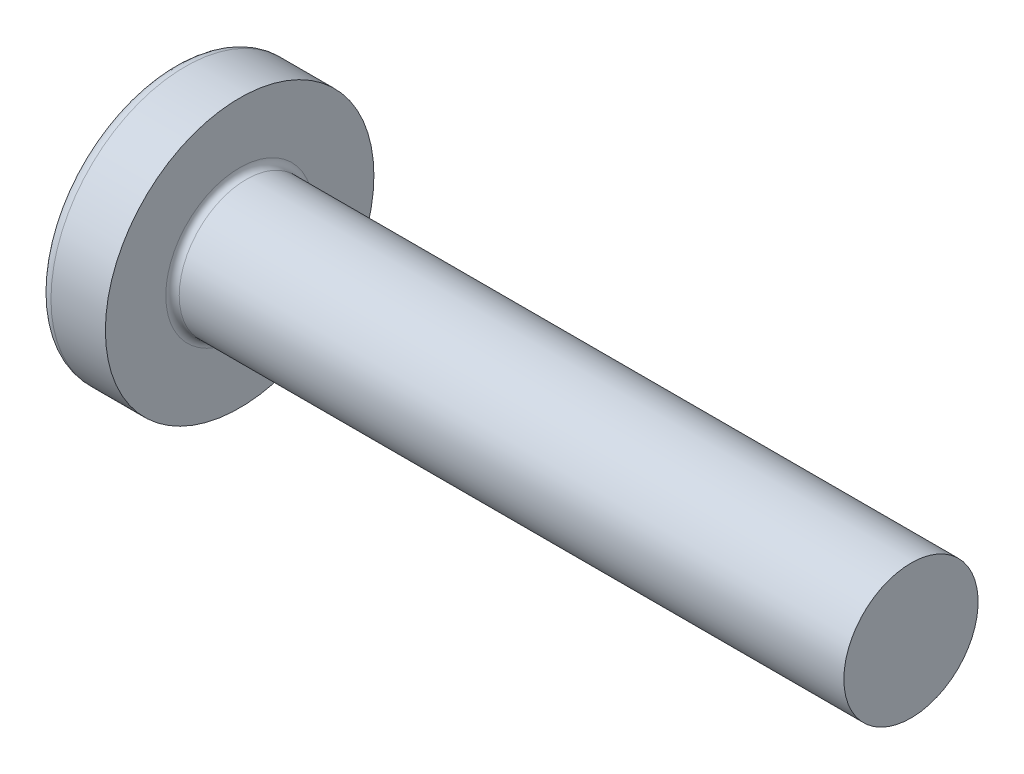
ISO-10303-21;
HEADER;
FILE_DESCRIPTION(('STEP AP214'),'2;1');
FILE_NAME('part.step','',(''),(''),'','','');
FILE_SCHEMA(('AUTOMOTIVE_DESIGN { 1 0 10303 214 1 1 1 1 }'));
ENDSEC;
DATA;
#1=APPLICATION_CONTEXT('core data for automotive mechanical design processes');
#2=APPLICATION_PROTOCOL_DEFINITION('international standard','automotive_design',2000,#1);
#3=PRODUCT_CONTEXT('',#1,'mechanical');
#4=PRODUCT('Part','Part','',(#3));
#5=PRODUCT_RELATED_PRODUCT_CATEGORY('part','',(#4));
#6=PRODUCT_DEFINITION_FORMATION('','',#4);
#7=PRODUCT_DEFINITION_CONTEXT('part definition',#1,'design');
#8=PRODUCT_DEFINITION('design','',#6,#7);
#9=PRODUCT_DEFINITION_SHAPE('','',#8);
#10=(LENGTH_UNIT() NAMED_UNIT(*) SI_UNIT(.MILLI.,.METRE.));
#11=(NAMED_UNIT(*) PLANE_ANGLE_UNIT() SI_UNIT($,.RADIAN.));
#12=(NAMED_UNIT(*) SI_UNIT($,.STERADIAN.) SOLID_ANGLE_UNIT());
#13=UNCERTAINTY_MEASURE_WITH_UNIT(LENGTH_MEASURE(1.E-05),#10,'distance_accuracy_value','');
#14=(GEOMETRIC_REPRESENTATION_CONTEXT(3) GLOBAL_UNCERTAINTY_ASSIGNED_CONTEXT((#13)) GLOBAL_UNIT_ASSIGNED_CONTEXT((#10,
#11,#12)) REPRESENTATION_CONTEXT('',''));
#15=CARTESIAN_POINT('',(0.,0.,0.));
#16=DIRECTION('',(0.,0.,1.));
#17=DIRECTION('',(1.,0.,0.));
#18=AXIS2_PLACEMENT_3D('',#15,#16,#17);
#19=CARTESIAN_POINT('',(3.2,0.,0.));
#20=DIRECTION('',(-1.,0.,0.));
#21=DIRECTION('',(0.,1.,0.));
#22=AXIS2_PLACEMENT_3D('',#19,#20,#21);
#23=SPHERICAL_SURFACE('',#22,3.2);
#24=CARTESIAN_POINT('',(0.646379599446113,0.,0.));
#25=DIRECTION('',(-1.,0.,0.));
#26=DIRECTION('',(0.,0.,1.));
#27=AXIS2_PLACEMENT_3D('',#24,#25,#26);
#28=CIRCLE('',#27,1.92847682119205);
#29=CARTESIAN_POINT('',(0.646379599446113,0.,1.92847682119205));
#30=VERTEX_POINT('',#29);
#31=EDGE_CURVE('E238',#30,#30,#28,.T.);
#32=ORIENTED_EDGE('',*,*,#31,.T.);
#33=EDGE_LOOP('',(#32));
#34=FACE_BOUND('',#33,.T.);
#35=CARTESIAN_POINT('',(0.0321614467928854,0.,0.));
#36=DIRECTION('',(1.,0.,0.));
#37=DIRECTION('',(0.,0.,-1.));
#38=AXIS2_PLACEMENT_3D('',#35,#36,#37);
#39=CIRCLE('',#38,0.452547125518057);
#40=CARTESIAN_POINT('',(0.0321614467928859,-0.239999999999999,-0.38366508938742));
#41=VERTEX_POINT('',#40);
#42=CARTESIAN_POINT('',(0.0321614467928854,-0.383665089387418,-0.24));
#43=VERTEX_POINT('',#42);
#44=EDGE_CURVE('E374',#41,#43,#39,.F.);
#45=ORIENTED_EDGE('',*,*,#44,.F.);
#46=CARTESIAN_POINT('',(3.2,-0.24,0.));
#47=DIRECTION('',(0.,1.,0.));
#48=DIRECTION('',(0.,0.,1.));
#49=AXIS2_PLACEMENT_3D('',#46,#47,#48);
#50=CIRCLE('',#49,3.19098730802866);
#51=CARTESIAN_POINT('',(0.160076673366103,-0.239999999999996,-0.970188728128244));
#52=VERTEX_POINT('',#51);
#53=EDGE_CURVE('E300',#52,#41,#50,.T.);
#54=ORIENTED_EDGE('',*,*,#53,.F.);
#55=CARTESIAN_POINT('',(2.98218780828175,0.,0.436863744320002));
#56=DIRECTION('',(0.446197753347436,0.,-0.894934391398443));
#57=DIRECTION('',(-0.894934391398442,0.,-0.446197753347436));
#58=AXIS2_PLACEMENT_3D('',#55,#56,#57);
#59=CIRCLE('',#58,3.16254769419176);
#60=CARTESIAN_POINT('',(0.160076673366103,0.240000000000003,-0.970188728128242));
#61=VERTEX_POINT('',#60);
#62=EDGE_CURVE('E272',#52,#61,#59,.T.);
#63=ORIENTED_EDGE('',*,*,#62,.T.);
#64=CARTESIAN_POINT('',(3.2,0.24,0.));
#65=DIRECTION('',(0.,-1.,0.));
#66=DIRECTION('',(0.,0.,-1.));
#67=AXIS2_PLACEMENT_3D('',#64,#65,#66);
#68=CIRCLE('',#67,3.19098730802866);
#69=CARTESIAN_POINT('',(0.0321614467928856,0.240000000000001,-0.383665089387418));
#70=VERTEX_POINT('',#69);
#71=EDGE_CURVE('E327',#70,#61,#68,.T.);
#72=ORIENTED_EDGE('',*,*,#71,.F.);
#73=CARTESIAN_POINT('',(0.0321614467928854,0.383665089387417,-0.24));
#74=VERTEX_POINT('',#73);
#75=EDGE_CURVE('E393',#74,#70,#39,.F.);
#76=ORIENTED_EDGE('',*,*,#75,.F.);
#77=CARTESIAN_POINT('',(3.2,0.,-0.24));
#78=DIRECTION('',(0.,0.,1.));
#79=DIRECTION('',(1.,0.,0.));
#80=AXIS2_PLACEMENT_3D('',#77,#78,#79);
#81=CIRCLE('',#80,3.19098730802866);
#82=CARTESIAN_POINT('',(0.160076673366103,0.970188728128243,-0.24));
#83=VERTEX_POINT('',#82);
#84=EDGE_CURVE('E266',#83,#74,#81,.T.);
#85=ORIENTED_EDGE('',*,*,#84,.F.);
#86=CARTESIAN_POINT('',(2.98218780828175,-0.436863744320003,0.));
#87=DIRECTION('',(0.446197753347436,0.894934391398443,0.));
#88=DIRECTION('',(-0.894934391398443,0.446197753347436,0.));
#89=AXIS2_PLACEMENT_3D('',#86,#87,#88);
#90=CIRCLE('',#89,3.16254769419176);
#91=CARTESIAN_POINT('',(0.160076673366104,0.970188728128243,0.24));
#92=VERTEX_POINT('',#91);
#93=EDGE_CURVE('E269',#83,#92,#90,.T.);
#94=ORIENTED_EDGE('',*,*,#93,.T.);
#95=CARTESIAN_POINT('',(3.2,0.,0.24));
#96=DIRECTION('',(0.,0.,-1.));
#97=DIRECTION('',(0.,1.,0.));
#98=AXIS2_PLACEMENT_3D('',#95,#96,#97);
#99=CIRCLE('',#98,3.19098730802866);
#100=CARTESIAN_POINT('',(0.0321614467928856,0.383665089387416,0.24));
#101=VERTEX_POINT('',#100);
#102=EDGE_CURVE('E262',#101,#92,#99,.T.);
#103=ORIENTED_EDGE('',*,*,#102,.F.);
#104=CARTESIAN_POINT('',(0.0321614467928857,0.239999999999999,0.38366508938742));
#105=VERTEX_POINT('',#104);
#106=EDGE_CURVE('E392',#105,#101,#39,.F.);
#107=ORIENTED_EDGE('',*,*,#106,.F.);
#108=CARTESIAN_POINT('',(0.160076673366103,0.239999999999997,0.970188728128244));
#109=VERTEX_POINT('',#108);
#110=EDGE_CURVE('E282',#109,#105,#68,.T.);
#111=ORIENTED_EDGE('',*,*,#110,.F.);
#112=CARTESIAN_POINT('',(2.98218780828175,0.,-0.436863744320003));
#113=DIRECTION('',(0.446197753347436,0.,0.894934391398443));
#114=DIRECTION('',(0.894934391398443,0.,-0.446197753347436));
#115=AXIS2_PLACEMENT_3D('',#112,#113,#114);
#116=CIRCLE('',#115,3.16254769419176);
#117=CARTESIAN_POINT('',(0.160076673366103,-0.240000000000003,0.970188728128242));
#118=VERTEX_POINT('',#117);
#119=EDGE_CURVE('E49',#109,#118,#116,.T.);
#120=ORIENTED_EDGE('',*,*,#119,.T.);
#121=CARTESIAN_POINT('',(0.032161446792886,-0.240000000000001,0.383665089387418));
#122=VERTEX_POINT('',#121);
#123=EDGE_CURVE('E279',#122,#118,#50,.T.);
#124=ORIENTED_EDGE('',*,*,#123,.F.);
#125=CARTESIAN_POINT('',(0.0321614467928856,-0.383665089387417,0.24));
#126=VERTEX_POINT('',#125);
#127=EDGE_CURVE('E432',#126,#122,#39,.F.);
#128=ORIENTED_EDGE('',*,*,#127,.F.);
#129=CARTESIAN_POINT('',(0.160076673366102,-0.970188728128243,0.24));
#130=VERTEX_POINT('',#129);
#131=EDGE_CURVE('E263',#130,#126,#99,.T.);
#132=ORIENTED_EDGE('',*,*,#131,.F.);
#133=CARTESIAN_POINT('',(2.98218780828175,0.436863744320002,0.));
#134=DIRECTION('',(0.446197753347436,-0.894934391398443,0.));
#135=DIRECTION('',(0.894934391398442,0.446197753347436,0.));
#136=AXIS2_PLACEMENT_3D('',#133,#134,#135);
#137=CIRCLE('',#136,3.16254769419176);
#138=CARTESIAN_POINT('',(0.160076673366102,-0.970188728128243,-0.24));
#139=VERTEX_POINT('',#138);
#140=EDGE_CURVE('E259',#130,#139,#137,.T.);
#141=ORIENTED_EDGE('',*,*,#140,.T.);
#142=EDGE_CURVE('E64',#43,#139,#81,.T.);
#143=ORIENTED_EDGE('',*,*,#142,.F.);
#144=EDGE_LOOP('',(#45,#54,#63,#72,#76,#85,#94,#103,#107,#111,#120,#124,#128,#132,#141,#143));
#145=FACE_BOUND('',#144,.T.);
#146=ADVANCED_FACE('F35',(#34,#145),#23,.T.);
#147=CARTESIAN_POINT('',(1.42,0.342014234961647,-0.24));
#148=DIRECTION('',(0.,0.,1.));
#149=DIRECTION('',(1.,0.,0.));
#150=AXIS2_PLACEMENT_3D('',#147,#148,#149);
#151=PLANE('',#150);
#152=ORIENTED_EDGE('',*,*,#84,.T.);
#153=CARTESIAN_POINT('',(-0.62681108769363,0.437068483436507,-0.24));
#154=CARTESIAN_POINT('',(-0.489788496230297,0.426133650703048,-0.24));
#155=CARTESIAN_POINT('',(-0.352772750933422,0.415111501643733,-0.24));
#156=CARTESIAN_POINT('',(-0.0787578829907056,0.392826208777529,-0.24));
#157=CARTESIAN_POINT('',(0.0582412392292551,0.381563059739326,-0.24));
#158=CARTESIAN_POINT('',(0.332213907649304,0.358729879929962,-0.24));
#159=CARTESIAN_POINT('',(0.46918745386203,0.347159849310859,-0.24));
#160=CARTESIAN_POINT('',(0.743097225466975,0.323608060037368,-0.24));
#161=CARTESIAN_POINT('',(0.880033451388893,0.311626307570274,-0.24));
#162=CARTESIAN_POINT('',(1.12503843748414,0.289667437084935,-0.24));
#163=CARTESIAN_POINT('',(1.23311691796933,0.279799173772307,-0.24));
#164=CARTESIAN_POINT('',(1.44922670187753,0.259570129963748,-0.24));
#165=CARTESIAN_POINT('',(1.55725800582188,0.249209355057115,-0.24));
#166=CARTESIAN_POINT('',(1.77325939836707,0.227783788845471,-0.24));
#167=CARTESIAN_POINT('',(1.88122948210773,0.216718947889267,-0.24));
#168=CARTESIAN_POINT('',(2.0430984848104,0.199296215266543,-0.24));
#169=CARTESIAN_POINT('',(2.0970415842079,0.193350927198989,-0.24));
#170=CARTESIAN_POINT('',(2.20488609257059,0.181086542758413,-0.24));
#171=CARTESIAN_POINT('',(2.25878750080571,0.174767439983005,-0.24));
#172=CARTESIAN_POINT('',(2.31266102218779,0.168212174785095,-0.24));
#173=B_SPLINE_CURVE_WITH_KNOTS('',3,(#153,#154,#155,#156,#157,#158,#159,#160,#161,#162,#163,
#164,#165,#166,#167,#168,#169,#170,#171,#172),.UNSPECIFIED.,.F.,.F.,(4,2,2,2,2,2,2,2,2,4),(0.,
0.412374804446791,0.824758569288173,1.23714212980074,1.64951949578321,1.97510284909568,
2.30068250838736,2.62628515326816,2.78909323574088,2.95190410746272),.UNSPECIFIED.);
#174=CARTESIAN_POINT('',(1.42,0.262259890185288,-0.240000000000001));
#175=VERTEX_POINT('',#174);
#176=EDGE_CURVE('E416',#74,#175,#173,.T.);
#177=ORIENTED_EDGE('',*,*,#176,.T.);
#178=DIRECTION('',(0.,1.,0.));
#179=VECTOR('',#178,1.);
#180=CARTESIAN_POINT('',(1.42,-0.342014234961648,-0.24));
#181=LINE('',#180,#179);
#182=CARTESIAN_POINT('',(1.42,0.342014234961647,-0.24));
#183=VERTEX_POINT('',#182);
#184=EDGE_CURVE('E356',#175,#183,#181,.T.);
#185=ORIENTED_EDGE('',*,*,#184,.T.);
#186=DIRECTION('',(0.894934391398442,-0.446197753347436,0.));
#187=VECTOR('',#186,1.);
#188=CARTESIAN_POINT('',(0.,1.05,-0.24));
#189=LINE('',#188,#187);
#190=EDGE_CURVE('E239',#83,#183,#189,.T.);
#191=ORIENTED_EDGE('',*,*,#190,.F.);
#192=EDGE_LOOP('',(#152,#177,#185,#191));
#193=FACE_BOUND('',#192,.T.);
#194=ADVANCED_FACE('F194',(#193),#151,.T.);
#195=CARTESIAN_POINT('',(1.42,-0.342014234961648,-0.24));
#196=VERTEX_POINT('',#195);
#197=CARTESIAN_POINT('',(1.42,-0.262259890185288,-0.240000000000001));
#198=VERTEX_POINT('',#197);
#199=EDGE_CURVE('E247',#196,#198,#181,.T.);
#200=ORIENTED_EDGE('',*,*,#199,.T.);
#201=CARTESIAN_POINT('',(-0.62681108769363,-0.437068483436507,-0.24));
#202=CARTESIAN_POINT('',(-0.489788496230297,-0.426133650703048,-0.24));
#203=CARTESIAN_POINT('',(-0.352772750933422,-0.415111501643733,-0.24));
#204=CARTESIAN_POINT('',(-0.0787578829907058,-0.392826208777529,-0.24));
#205=CARTESIAN_POINT('',(0.058241239229255,-0.381563059739326,-0.24));
#206=CARTESIAN_POINT('',(0.332213907649304,-0.358729879929962,-0.24));
#207=CARTESIAN_POINT('',(0.46918745386203,-0.347159849310859,-0.24));
#208=CARTESIAN_POINT('',(0.743097225466975,-0.323608060037368,-0.24));
#209=CARTESIAN_POINT('',(0.880033451388893,-0.311626307570274,-0.24));
#210=CARTESIAN_POINT('',(1.12503843748414,-0.289667437084935,-0.24));
#211=CARTESIAN_POINT('',(1.23311691796933,-0.279799173772307,-0.24));
#212=CARTESIAN_POINT('',(1.44922670187753,-0.259570129963748,-0.24));
#213=CARTESIAN_POINT('',(1.55725800582188,-0.249209355057115,-0.24));
#214=CARTESIAN_POINT('',(1.77325939836707,-0.227783788845471,-0.24));
#215=CARTESIAN_POINT('',(1.88122948210773,-0.216718947889267,-0.24));
#216=CARTESIAN_POINT('',(2.0430984848104,-0.199296215266543,-0.24));
#217=CARTESIAN_POINT('',(2.0970415842079,-0.193350927198989,-0.24));
#218=CARTESIAN_POINT('',(2.20488609257059,-0.181086542758413,-0.24));
#219=CARTESIAN_POINT('',(2.25878750080571,-0.174767439983005,-0.24));
#220=CARTESIAN_POINT('',(2.31266102218779,-0.168212174785094,-0.24));
#221=B_SPLINE_CURVE_WITH_KNOTS('',3,(#201,#202,#203,#204,#205,#206,#207,#208,#209,#210,#211,
#212,#213,#214,#215,#216,#217,#218,#219,#220),.UNSPECIFIED.,.F.,.F.,(4,2,2,2,2,2,2,2,2,4),(0.,
0.412374804446791,0.824758569288173,1.23714212980074,1.64951949578321,1.97510284909568,
2.30068250838736,2.62628515326816,2.78909323574088,2.95190410746272),.UNSPECIFIED.);
#222=EDGE_CURVE('E391',#198,#43,#221,.F.);
#223=ORIENTED_EDGE('',*,*,#222,.T.);
#224=ORIENTED_EDGE('',*,*,#142,.T.);
#225=DIRECTION('',(0.894934391398442,0.446197753347436,0.));
#226=VECTOR('',#225,1.);
#227=CARTESIAN_POINT('',(0.,-1.05,-0.24));
#228=LINE('',#227,#226);
#229=EDGE_CURVE('E330',#139,#196,#228,.T.);
#230=ORIENTED_EDGE('',*,*,#229,.T.);
#231=EDGE_LOOP('',(#200,#223,#224,#230));
#232=FACE_BOUND('',#231,.T.);
#233=ADVANCED_FACE('F200',(#232),#151,.T.);
#234=CARTESIAN_POINT('',(1.42,-0.342014234961647,0.24));
#235=DIRECTION('',(0.,0.,-1.));
#236=DIRECTION('',(0.,1.,0.));
#237=AXIS2_PLACEMENT_3D('',#234,#235,#236);
#238=PLANE('',#237);
#239=DIRECTION('',(0.,-1.,0.));
#240=VECTOR('',#239,1.);
#241=CARTESIAN_POINT('',(1.42,0.342014234961647,0.24));
#242=LINE('',#241,#240);
#243=CARTESIAN_POINT('',(1.42,0.342014234961647,0.24));
#244=VERTEX_POINT('',#243);
#245=CARTESIAN_POINT('',(1.42,0.262259890185288,0.240000000000001));
#246=VERTEX_POINT('',#245);
#247=EDGE_CURVE('E339',#244,#246,#242,.T.);
#248=ORIENTED_EDGE('',*,*,#247,.T.);
#249=CARTESIAN_POINT('',(-0.626811087646333,0.437068483432734,0.24));
#250=CARTESIAN_POINT('',(-0.489788496188268,0.426133650699674,0.24));
#251=CARTESIAN_POINT('',(-0.35277275089666,0.415111501640761,0.24));
#252=CARTESIAN_POINT('',(-0.0787578829644779,0.392826208775377,0.24));
#253=CARTESIAN_POINT('',(0.0582412392502162,0.381563059737591,0.24));
#254=CARTESIAN_POINT('',(0.332213907654152,0.358729879929546,0.24));
#255=CARTESIAN_POINT('',(0.469187453856034,0.347159849311357,0.24));
#256=CARTESIAN_POINT('',(0.743097225439297,0.323608060039765,0.24));
#257=CARTESIAN_POINT('',(0.880033451350377,0.311626307573655,0.24));
#258=CARTESIAN_POINT('',(1.12503843743479,0.289667437089413,0.24));
#259=CARTESIAN_POINT('',(1.23311691792,0.279799173776849,0.24));
#260=CARTESIAN_POINT('',(1.4492267018282,0.259570129968442,0.24));
#261=CARTESIAN_POINT('',(1.55725800577256,0.249209355061897,0.24));
#262=CARTESIAN_POINT('',(1.77325939831777,0.227783788850472,0.24));
#263=CARTESIAN_POINT('',(1.88122948205844,0.216718947894399,0.24));
#264=CARTESIAN_POINT('',(2.04309848476113,0.199296215271932,0.24));
#265=CARTESIAN_POINT('',(2.09704158415864,0.193350927204474,0.24));
#266=CARTESIAN_POINT('',(2.20488609252136,0.181086542764125,0.24));
#267=CARTESIAN_POINT('',(2.25878750075649,0.174767439988846,0.24));
#268=CARTESIAN_POINT('',(2.31266102213859,0.168212174791089,0.24));
#269=B_SPLINE_CURVE_WITH_KNOTS('',3,(#249,#250,#251,#252,#253,#254,#255,#256,#257,#258,#259,
#260,#261,#262,#263,#264,#265,#266,#267,#268),.UNSPECIFIED.,.F.,.F.,(4,2,2,2,2,2,2,2,2,4),(0.,
0.412374804430943,0.824758569256476,1.23714212973639,1.64951949568622,1.97510284899868,
2.30068250829037,2.62628515317116,2.78909323564388,2.95190410736571),.UNSPECIFIED.);
#270=EDGE_CURVE('E671',#246,#101,#269,.F.);
#271=ORIENTED_EDGE('',*,*,#270,.T.);
#272=ORIENTED_EDGE('',*,*,#102,.T.);
#273=DIRECTION('',(0.894934391398442,-0.446197753347436,0.));
#274=VECTOR('',#273,1.);
#275=CARTESIAN_POINT('',(0.,1.05,0.24));
#276=LINE('',#275,#274);
#277=EDGE_CURVE('E244',#92,#244,#276,.T.);
#278=ORIENTED_EDGE('',*,*,#277,.T.);
#279=EDGE_LOOP('',(#248,#271,#272,#278));
#280=FACE_BOUND('',#279,.T.);
#281=ADVANCED_FACE('F412',(#280),#238,.T.);
#282=ORIENTED_EDGE('',*,*,#131,.T.);
#283=CARTESIAN_POINT('',(-0.626811087646333,-0.437068483432734,0.24));
#284=CARTESIAN_POINT('',(-0.489788496188268,-0.426133650699674,0.24));
#285=CARTESIAN_POINT('',(-0.35277275089666,-0.415111501640761,0.24));
#286=CARTESIAN_POINT('',(-0.0787578829644779,-0.392826208775377,0.24));
#287=CARTESIAN_POINT('',(0.0582412392502161,-0.381563059737591,0.24));
#288=CARTESIAN_POINT('',(0.332213907654152,-0.358729879929546,0.24));
#289=CARTESIAN_POINT('',(0.469187453856034,-0.347159849311357,0.24));
#290=CARTESIAN_POINT('',(0.743097225439297,-0.323608060039765,0.24));
#291=CARTESIAN_POINT('',(0.880033451350377,-0.311626307573655,0.24));
#292=CARTESIAN_POINT('',(1.12503843743479,-0.289667437089413,0.24));
#293=CARTESIAN_POINT('',(1.23311691792,-0.279799173776849,0.24));
#294=CARTESIAN_POINT('',(1.4492267018282,-0.259570129968442,0.24));
#295=CARTESIAN_POINT('',(1.55725800577256,-0.249209355061897,0.24));
#296=CARTESIAN_POINT('',(1.77325939831777,-0.227783788850472,0.24));
#297=CARTESIAN_POINT('',(1.88122948205844,-0.216718947894399,0.24));
#298=CARTESIAN_POINT('',(2.04309848476113,-0.199296215271932,0.24));
#299=CARTESIAN_POINT('',(2.09704158415864,-0.193350927204474,0.24));
#300=CARTESIAN_POINT('',(2.20488609252136,-0.181086542764125,0.24));
#301=CARTESIAN_POINT('',(2.25878750075649,-0.174767439988846,0.24));
#302=CARTESIAN_POINT('',(2.31266102213859,-0.168212174791089,0.24));
#303=B_SPLINE_CURVE_WITH_KNOTS('',3,(#283,#284,#285,#286,#287,#288,#289,#290,#291,#292,#293,
#294,#295,#296,#297,#298,#299,#300,#301,#302),.UNSPECIFIED.,.F.,.F.,(4,2,2,2,2,2,2,2,2,4),(0.,
0.412374804430943,0.824758569256476,1.23714212973639,1.64951949568622,1.97510284899868,
2.30068250829037,2.62628515317116,2.78909323564388,2.95190410736571),.UNSPECIFIED.);
#304=CARTESIAN_POINT('',(1.42,-0.262259890185289,0.240000000000001));
#305=VERTEX_POINT('',#304);
#306=EDGE_CURVE('E433',#126,#305,#303,.T.);
#307=ORIENTED_EDGE('',*,*,#306,.T.);
#308=CARTESIAN_POINT('',(1.42,-0.342014234961648,0.24));
#309=VERTEX_POINT('',#308);
#310=EDGE_CURVE('E341',#305,#309,#242,.T.);
#311=ORIENTED_EDGE('',*,*,#310,.T.);
#312=DIRECTION('',(0.894934391398442,0.446197753347436,0.));
#313=VECTOR('',#312,1.);
#314=CARTESIAN_POINT('',(0.,-1.05,0.24));
#315=LINE('',#314,#313);
#316=EDGE_CURVE('E332',#130,#309,#315,.T.);
#317=ORIENTED_EDGE('',*,*,#316,.F.);
#318=EDGE_LOOP('',(#282,#307,#311,#317));
#319=FACE_BOUND('',#318,.T.);
#320=ADVANCED_FACE('F519',(#319),#238,.T.);
#321=CARTESIAN_POINT('',(0.,1.05,0.24));
#322=DIRECTION('',(0.446197753347436,0.894934391398443,0.));
#323=DIRECTION('',(-0.894934391398443,0.446197753347436,0.));
#324=AXIS2_PLACEMENT_3D('',#321,#322,#323);
#325=PLANE('',#324);
#326=CARTESIAN_POINT('',(2.01772965253961,0.0439972734550525,0.));
#327=DIRECTION('',(0.446197753347436,0.894934391398443,0.));
#328=DIRECTION('',(-0.894934391398443,0.446197753347436,0.));
#329=AXIS2_PLACEMENT_3D('',#326,#327,#328);
#330=ELLIPSE('',#329,0.703057486597294,0.310602005333466);
#331=CARTESIAN_POINT('',(1.42,0.342014234961648,0.0969871799961127));
#332=VERTEX_POINT('',#331);
#333=CARTESIAN_POINT('',(1.42,0.342014234961648,-0.0969871799961128));
#334=VERTEX_POINT('',#333);
#335=EDGE_CURVE('E305',#332,#334,#330,.F.);
#336=ORIENTED_EDGE('',*,*,#335,.F.);
#337=DIRECTION('',(0.,0.,-1.));
#338=VECTOR('',#337,1.);
#339=CARTESIAN_POINT('',(1.42,0.342014234961647,0.24));
#340=LINE('',#339,#338);
#341=EDGE_CURVE('E342',#244,#332,#340,.T.);
#342=ORIENTED_EDGE('',*,*,#341,.F.);
#343=ORIENTED_EDGE('',*,*,#277,.F.);
#344=ORIENTED_EDGE('',*,*,#93,.F.);
#345=ORIENTED_EDGE('',*,*,#190,.T.);
#346=EDGE_CURVE('E344',#334,#183,#340,.T.);
#347=ORIENTED_EDGE('',*,*,#346,.F.);
#348=EDGE_LOOP('',(#336,#342,#343,#344,#345,#347));
#349=FACE_BOUND('',#348,.T.);
#350=ADVANCED_FACE('F410',(#349),#325,.F.);
#351=CARTESIAN_POINT('',(0.,-1.05,-0.24));
#352=DIRECTION('',(0.446197753347436,-0.894934391398443,0.));
#353=DIRECTION('',(0.894934391398442,0.446197753347436,0.));
#354=AXIS2_PLACEMENT_3D('',#351,#352,#353);
#355=PLANE('',#354);
#356=CARTESIAN_POINT('',(2.01772965253961,-0.0439972734550525,0.));
#357=DIRECTION('',(0.446197753347436,-0.894934391398443,0.));
#358=DIRECTION('',(-0.894934391398443,-0.446197753347436,0.));
#359=AXIS2_PLACEMENT_3D('',#356,#357,#358);
#360=ELLIPSE('',#359,0.703057486597294,0.310602005333466);
#361=CARTESIAN_POINT('',(1.42,-0.342014234961649,-0.0969871799961111));
#362=VERTEX_POINT('',#361);
#363=CARTESIAN_POINT('',(1.42,-0.342014234961649,0.096987179996111));
#364=VERTEX_POINT('',#363);
#365=EDGE_CURVE('E673',#362,#364,#360,.F.);
#366=ORIENTED_EDGE('',*,*,#365,.F.);
#367=DIRECTION('',(0.,0.,1.));
#368=VECTOR('',#367,1.);
#369=CARTESIAN_POINT('',(1.42,-0.342014234961648,-0.24));
#370=LINE('',#369,#368);
#371=EDGE_CURVE('E335',#196,#362,#370,.T.);
#372=ORIENTED_EDGE('',*,*,#371,.F.);
#373=ORIENTED_EDGE('',*,*,#229,.F.);
#374=ORIENTED_EDGE('',*,*,#140,.F.);
#375=ORIENTED_EDGE('',*,*,#316,.T.);
#376=EDGE_CURVE('E338',#364,#309,#370,.T.);
#377=ORIENTED_EDGE('',*,*,#376,.F.);
#378=EDGE_LOOP('',(#366,#372,#373,#374,#375,#377));
#379=FACE_BOUND('',#378,.T.);
#380=ADVANCED_FACE('F506',(#379),#355,.F.);
#381=CARTESIAN_POINT('',(1.42,0.342014234961647,-0.24));
#382=DIRECTION('',(-1.,0.,0.));
#383=DIRECTION('',(0.,0.,1.));
#384=AXIS2_PLACEMENT_3D('',#381,#382,#383);
#385=PLANE('',#384);
#386=DIRECTION('',(0.,1.,0.));
#387=VECTOR('',#386,1.);
#388=CARTESIAN_POINT('',(1.42,-0.240000000000001,0.342014234961646));
#389=LINE('',#388,#387);
#390=CARTESIAN_POINT('',(1.42,-0.240000000000001,0.342014234961646));
#391=VERTEX_POINT('',#390);
#392=CARTESIAN_POINT('',(1.42,-0.096987179996118,0.342014234961647));
#393=VERTEX_POINT('',#392);
#394=EDGE_CURVE('E320',#391,#393,#389,.T.);
#395=ORIENTED_EDGE('',*,*,#394,.T.);
#396=CARTESIAN_POINT('',(1.42,0.,0.));
#397=DIRECTION('',(-1.,0.,0.));
#398=DIRECTION('',(0.,0.,1.));
#399=AXIS2_PLACEMENT_3D('',#396,#397,#398);
#400=CIRCLE('',#399,0.3555);
#401=CARTESIAN_POINT('',(1.42,-0.240000000000001,0.262259890185288));
#402=VERTEX_POINT('',#401);
#403=EDGE_CURVE('E701',#402,#393,#400,.T.);
#404=ORIENTED_EDGE('',*,*,#403,.F.);
#405=DIRECTION('',(0.,0.,-1.));
#406=VECTOR('',#405,1.);
#407=CARTESIAN_POINT('',(1.42,-0.240000000000001,0.342014234961646));
#408=LINE('',#407,#406);
#409=EDGE_CURVE('E316',#391,#402,#408,.T.);
#410=ORIENTED_EDGE('',*,*,#409,.F.);
#411=EDGE_LOOP('',(#395,#404,#410));
#412=FACE_BOUND('',#411,.T.);
#413=ADVANCED_FACE('F499',(#412),#385,.T.);
#414=ORIENTED_EDGE('',*,*,#310,.F.);
#415=EDGE_CURVE('E706',#364,#305,#400,.T.);
#416=ORIENTED_EDGE('',*,*,#415,.F.);
#417=ORIENTED_EDGE('',*,*,#376,.T.);
#418=EDGE_LOOP('',(#414,#416,#417));
#419=FACE_BOUND('',#418,.T.);
#420=ADVANCED_FACE('F492',(#419),#385,.T.);
#421=ORIENTED_EDGE('',*,*,#371,.T.);
#422=EDGE_CURVE('E385',#198,#362,#400,.T.);
#423=ORIENTED_EDGE('',*,*,#422,.F.);
#424=ORIENTED_EDGE('',*,*,#199,.F.);
#425=EDGE_LOOP('',(#421,#423,#424));
#426=FACE_BOUND('',#425,.T.);
#427=ADVANCED_FACE('F486',(#426),#385,.T.);
#428=CARTESIAN_POINT('',(1.42,-0.239999999999999,-0.262259890185288));
#429=VERTEX_POINT('',#428);
#430=CARTESIAN_POINT('',(1.42,-0.239999999999999,-0.342014234961648));
#431=VERTEX_POINT('',#430);
#432=EDGE_CURVE('E319',#429,#431,#408,.T.);
#433=ORIENTED_EDGE('',*,*,#432,.F.);
#434=CARTESIAN_POINT('',(1.42,-0.0969871799961141,-0.342014234961648));
#435=VERTEX_POINT('',#434);
#436=EDGE_CURVE('E56',#435,#429,#400,.T.);
#437=ORIENTED_EDGE('',*,*,#436,.F.);
#438=DIRECTION('',(0.,-1.,0.));
#439=VECTOR('',#438,1.);
#440=CARTESIAN_POINT('',(1.42,0.240000000000001,-0.342014234961647));
#441=LINE('',#440,#439);
#442=EDGE_CURVE('E315',#435,#431,#441,.T.);
#443=ORIENTED_EDGE('',*,*,#442,.T.);
#444=EDGE_LOOP('',(#433,#437,#443));
#445=FACE_BOUND('',#444,.T.);
#446=ADVANCED_FACE('F380',(#445),#385,.T.);
#447=CARTESIAN_POINT('',(1.42,0.240000000000001,-0.342014234961647));
#448=VERTEX_POINT('',#447);
#449=CARTESIAN_POINT('',(1.42,0.0969871799961165,-0.342014234961647));
#450=VERTEX_POINT('',#449);
#451=EDGE_CURVE('E312',#448,#450,#441,.T.);
#452=ORIENTED_EDGE('',*,*,#451,.T.);
#453=CARTESIAN_POINT('',(1.42,0.240000000000001,-0.262259890185288));
#454=VERTEX_POINT('',#453);
#455=EDGE_CURVE('E384',#454,#450,#400,.T.);
#456=ORIENTED_EDGE('',*,*,#455,.F.);
#457=DIRECTION('',(0.,0.,1.));
#458=VECTOR('',#457,1.);
#459=CARTESIAN_POINT('',(1.42,0.240000000000001,-0.342014234961647));
#460=LINE('',#459,#458);
#461=EDGE_CURVE('E324',#448,#454,#460,.T.);
#462=ORIENTED_EDGE('',*,*,#461,.F.);
#463=EDGE_LOOP('',(#452,#456,#462));
#464=FACE_BOUND('',#463,.T.);
#465=ADVANCED_FACE('F474',(#464),#385,.T.);
#466=ORIENTED_EDGE('',*,*,#184,.F.);
#467=EDGE_CURVE('E690',#334,#175,#400,.T.);
#468=ORIENTED_EDGE('',*,*,#467,.F.);
#469=ORIENTED_EDGE('',*,*,#346,.T.);
#470=EDGE_LOOP('',(#466,#468,#469));
#471=FACE_BOUND('',#470,.T.);
#472=ADVANCED_FACE('F467',(#471),#385,.T.);
#473=ORIENTED_EDGE('',*,*,#341,.T.);
#474=EDGE_CURVE('E692',#246,#332,#400,.T.);
#475=ORIENTED_EDGE('',*,*,#474,.F.);
#476=ORIENTED_EDGE('',*,*,#247,.F.);
#477=EDGE_LOOP('',(#473,#475,#476));
#478=FACE_BOUND('',#477,.T.);
#479=ADVANCED_FACE('F461',(#478),#385,.T.);
#480=CARTESIAN_POINT('',(1.42,0.239999999999999,0.342014234961648));
#481=DIRECTION('',(0.,-1.,0.));
#482=DIRECTION('',(1.,0.,0.));
#483=AXIS2_PLACEMENT_3D('',#480,#481,#482);
#484=PLANE('',#483);
#485=ORIENTED_EDGE('',*,*,#110,.T.);
#486=CARTESIAN_POINT('',(-0.626811087646333,0.239999999999999,0.437068483432734));
#487=CARTESIAN_POINT('',(-0.489788496188268,0.239999999999999,0.426133650699675));
#488=CARTESIAN_POINT('',(-0.35277275089666,0.239999999999999,0.415111501640762));
#489=CARTESIAN_POINT('',(-0.0787578829644779,0.239999999999999,0.392826208775378));
#490=CARTESIAN_POINT('',(0.0582412392502162,0.239999999999999,0.381563059737591));
#491=CARTESIAN_POINT('',(0.332213907654152,0.239999999999999,0.358729879929547));
#492=CARTESIAN_POINT('',(0.469187453856034,0.239999999999999,0.347159849311358));
#493=CARTESIAN_POINT('',(0.743097225439297,0.239999999999999,0.323608060039766));
#494=CARTESIAN_POINT('',(0.880033451350377,0.239999999999999,0.311626307573656));
#495=CARTESIAN_POINT('',(1.12503843743479,0.239999999999999,0.289667437089414));
#496=CARTESIAN_POINT('',(1.23311691792,0.239999999999999,0.279799173776849));
#497=CARTESIAN_POINT('',(1.4492267018282,0.239999999999999,0.259570129968442));
#498=CARTESIAN_POINT('',(1.55725800577256,0.239999999999999,0.249209355061898));
#499=CARTESIAN_POINT('',(1.77325939831777,0.239999999999999,0.227783788850473));
#500=CARTESIAN_POINT('',(1.88122948205844,0.239999999999999,0.216718947894399));
#501=CARTESIAN_POINT('',(2.04309848476113,0.239999999999999,0.199296215271933));
#502=CARTESIAN_POINT('',(2.09704158415864,0.239999999999999,0.193350927204475));
#503=CARTESIAN_POINT('',(2.20488609252136,0.239999999999999,0.181086542764126));
#504=CARTESIAN_POINT('',(2.25878750075649,0.239999999999999,0.174767439988847));
#505=CARTESIAN_POINT('',(2.31266102213859,0.239999999999999,0.16821217479109));
#506=B_SPLINE_CURVE_WITH_KNOTS('',3,(#486,#487,#488,#489,#490,#491,#492,#493,#494,#495,#496,
#497,#498,#499,#500,#501,#502,#503,#504,#505),.UNSPECIFIED.,.F.,.F.,(4,2,2,2,2,2,2,2,2,4),(0.,
0.412374804430943,0.824758569256476,1.23714212973639,1.64951949568622,1.97510284899868,
2.30068250829037,2.62628515317116,2.78909323564388,2.95190410736571),.UNSPECIFIED.);
#507=CARTESIAN_POINT('',(1.42,0.239999999999999,0.26225989018529));
#508=VERTEX_POINT('',#507);
#509=EDGE_CURVE('E670',#105,#508,#506,.T.);
#510=ORIENTED_EDGE('',*,*,#509,.T.);
#511=CARTESIAN_POINT('',(1.42,0.239999999999999,0.342014234961648));
#512=VERTEX_POINT('',#511);
#513=EDGE_CURVE('E297',#508,#512,#460,.T.);
#514=ORIENTED_EDGE('',*,*,#513,.T.);
#515=DIRECTION('',(0.894934391398442,0.,-0.446197753347436));
#516=VECTOR('',#515,1.);
#517=CARTESIAN_POINT('',(0.,0.239999999999996,1.05));
#518=LINE('',#517,#516);
#519=EDGE_CURVE('E290',#109,#512,#518,.T.);
#520=ORIENTED_EDGE('',*,*,#519,.F.);
#521=EDGE_LOOP('',(#485,#510,#514,#520));
#522=FACE_BOUND('',#521,.T.);
#523=ADVANCED_FACE('F294',(#522),#484,.T.);
#524=CARTESIAN_POINT('',(1.42,-0.239999999999999,-0.342014234961648));
#525=DIRECTION('',(0.,1.,0.));
#526=DIRECTION('',(0.,0.,1.));
#527=AXIS2_PLACEMENT_3D('',#524,#525,#526);
#528=PLANE('',#527);
#529=ORIENTED_EDGE('',*,*,#409,.T.);
#530=CARTESIAN_POINT('',(-0.626811087646333,-0.240000000000001,0.437068483432733));
#531=CARTESIAN_POINT('',(-0.489788496188268,-0.240000000000001,0.426133650699673));
#532=CARTESIAN_POINT('',(-0.35277275089666,-0.240000000000001,0.415111501640761));
#533=CARTESIAN_POINT('',(-0.0787578829644782,-0.240000000000001,0.392826208775376));
#534=CARTESIAN_POINT('',(0.0582412392502159,-0.240000000000001,0.38156305973759));
#535=CARTESIAN_POINT('',(0.332213907654152,-0.240000000000001,0.358729879929545));
#536=CARTESIAN_POINT('',(0.469187453856034,-0.240000000000001,0.347159849311357));
#537=CARTESIAN_POINT('',(0.743097225439297,-0.240000000000001,0.323608060039764));
#538=CARTESIAN_POINT('',(0.880033451350377,-0.240000000000001,0.311626307573654));
#539=CARTESIAN_POINT('',(1.12503843743479,-0.240000000000001,0.289667437089413));
#540=CARTESIAN_POINT('',(1.23311691791999,-0.240000000000001,0.279799173776848));
#541=CARTESIAN_POINT('',(1.4492267018282,-0.240000000000001,0.259570129968441));
#542=CARTESIAN_POINT('',(1.55725800577256,-0.240000000000001,0.249209355061896));
#543=CARTESIAN_POINT('',(1.77325939831777,-0.240000000000001,0.227783788850472));
#544=CARTESIAN_POINT('',(1.88122948205844,-0.240000000000001,0.216718947894398));
#545=CARTESIAN_POINT('',(2.04309848476113,-0.240000000000001,0.199296215271931));
#546=CARTESIAN_POINT('',(2.09704158415864,-0.240000000000001,0.193350927204474));
#547=CARTESIAN_POINT('',(2.20488609252136,-0.240000000000001,0.181086542764124));
#548=CARTESIAN_POINT('',(2.25878750075649,-0.240000000000001,0.174767439988845));
#549=CARTESIAN_POINT('',(2.31266102213859,-0.240000000000001,0.168212174791088));
#550=B_SPLINE_CURVE_WITH_KNOTS('',3,(#530,#531,#532,#533,#534,#535,#536,#537,#538,#539,#540,
#541,#542,#543,#544,#545,#546,#547,#548,#549),.UNSPECIFIED.,.F.,.F.,(4,2,2,2,2,2,2,2,2,4),(0.,
0.412374804430942,0.824758569256476,1.23714212973639,1.64951949568622,1.97510284899868,
2.30068250829037,2.62628515317116,2.78909323564388,2.95190410736571),.UNSPECIFIED.);
#551=EDGE_CURVE('E425',#402,#122,#550,.F.);
#552=ORIENTED_EDGE('',*,*,#551,.T.);
#553=ORIENTED_EDGE('',*,*,#123,.T.);
#554=DIRECTION('',(0.894934391398442,0.,-0.446197753347436));
#555=VECTOR('',#554,1.);
#556=CARTESIAN_POINT('',(0.,-0.240000000000004,1.05));
#557=LINE('',#556,#555);
#558=EDGE_CURVE('E292',#118,#391,#557,.T.);
#559=ORIENTED_EDGE('',*,*,#558,.T.);
#560=EDGE_LOOP('',(#529,#552,#553,#559));
#561=FACE_BOUND('',#560,.T.);
#562=ADVANCED_FACE('F229',(#561),#528,.T.);
#563=CARTESIAN_POINT('',(0.,-0.240000000000004,1.05));
#564=DIRECTION('',(0.446197753347436,0.,0.894934391398443));
#565=DIRECTION('',(-0.894934391398443,0.,0.446197753347436));
#566=AXIS2_PLACEMENT_3D('',#563,#564,#565);
#567=PLANE('',#566);
#568=CARTESIAN_POINT('',(2.01772965253961,0.,0.0439972734550526));
#569=DIRECTION('',(0.446197753347436,0.,0.894934391398443));
#570=DIRECTION('',(-0.894934391398443,0.,0.446197753347436));
#571=AXIS2_PLACEMENT_3D('',#568,#569,#570);
#572=ELLIPSE('',#571,0.703057486597294,0.310602005333466);
#573=CARTESIAN_POINT('',(1.42,0.0969871799961156,0.342014234961648));
#574=VERTEX_POINT('',#573);
#575=EDGE_CURVE('E423',#393,#574,#572,.F.);
#576=ORIENTED_EDGE('',*,*,#575,.F.);
#577=ORIENTED_EDGE('',*,*,#394,.F.);
#578=ORIENTED_EDGE('',*,*,#558,.F.);
#579=ORIENTED_EDGE('',*,*,#119,.F.);
#580=ORIENTED_EDGE('',*,*,#519,.T.);
#581=EDGE_CURVE('E323',#574,#512,#389,.T.);
#582=ORIENTED_EDGE('',*,*,#581,.F.);
#583=EDGE_LOOP('',(#576,#577,#578,#579,#580,#582));
#584=FACE_BOUND('',#583,.T.);
#585=ADVANCED_FACE('F288',(#584),#567,.F.);
#586=CARTESIAN_POINT('',(0.,0.240000000000004,-1.05));
#587=DIRECTION('',(0.446197753347436,0.,-0.894934391398443));
#588=DIRECTION('',(0.894934391398442,0.,0.446197753347436));
#589=AXIS2_PLACEMENT_3D('',#586,#587,#588);
#590=PLANE('',#589);
#591=CARTESIAN_POINT('',(2.01772965253961,0.,-0.0439972734550525));
#592=DIRECTION('',(0.446197753347436,0.,-0.894934391398443));
#593=DIRECTION('',(-0.894934391398443,0.,-0.446197753347436));
#594=AXIS2_PLACEMENT_3D('',#591,#592,#593);
#595=ELLIPSE('',#594,0.703057486597294,0.310602005333466);
#596=EDGE_CURVE('E378',#450,#435,#595,.F.);
#597=ORIENTED_EDGE('',*,*,#596,.F.);
#598=ORIENTED_EDGE('',*,*,#451,.F.);
#599=DIRECTION('',(0.894934391398442,0.,0.446197753347436));
#600=VECTOR('',#599,1.);
#601=CARTESIAN_POINT('',(0.,0.240000000000004,-1.05));
#602=LINE('',#601,#600);
#603=EDGE_CURVE('E302',#61,#448,#602,.T.);
#604=ORIENTED_EDGE('',*,*,#603,.F.);
#605=ORIENTED_EDGE('',*,*,#62,.F.);
#606=DIRECTION('',(0.894934391398442,0.,0.446197753347436));
#607=VECTOR('',#606,1.);
#608=CARTESIAN_POINT('',(0.,-0.239999999999996,-1.05));
#609=LINE('',#608,#607);
#610=EDGE_CURVE('E309',#52,#431,#609,.T.);
#611=ORIENTED_EDGE('',*,*,#610,.T.);
#612=ORIENTED_EDGE('',*,*,#442,.F.);
#613=EDGE_LOOP('',(#597,#598,#604,#605,#611,#612));
#614=FACE_BOUND('',#613,.T.);
#615=ADVANCED_FACE('F369',(#614),#590,.F.);
#616=ORIENTED_EDGE('',*,*,#461,.T.);
#617=CARTESIAN_POINT('',(-0.626811087646333,0.240000000000002,-0.437068483432733));
#618=CARTESIAN_POINT('',(-0.489788496188268,0.240000000000002,-0.426133650699673));
#619=CARTESIAN_POINT('',(-0.35277275089666,0.240000000000001,-0.415111501640761));
#620=CARTESIAN_POINT('',(-0.0787578829644782,0.240000000000001,-0.392826208775376));
#621=CARTESIAN_POINT('',(0.0582412392502159,0.240000000000001,-0.38156305973759));
#622=CARTESIAN_POINT('',(0.332213907654152,0.240000000000001,-0.358729879929545));
#623=CARTESIAN_POINT('',(0.469187453856034,0.240000000000001,-0.347159849311356));
#624=CARTESIAN_POINT('',(0.743097225439297,0.240000000000001,-0.323608060039764));
#625=CARTESIAN_POINT('',(0.880033451350377,0.240000000000001,-0.311626307573654));
#626=CARTESIAN_POINT('',(1.12503843743479,0.240000000000001,-0.289667437089412));
#627=CARTESIAN_POINT('',(1.23311691791999,0.240000000000001,-0.279799173776848));
#628=CARTESIAN_POINT('',(1.4492267018282,0.240000000000001,-0.259570129968441));
#629=CARTESIAN_POINT('',(1.55725800577256,0.240000000000001,-0.249209355061896));
#630=CARTESIAN_POINT('',(1.77325939831777,0.240000000000001,-0.227783788850472));
#631=CARTESIAN_POINT('',(1.88122948205844,0.240000000000001,-0.216718947894398));
#632=CARTESIAN_POINT('',(2.04309848476113,0.240000000000001,-0.199296215271931));
#633=CARTESIAN_POINT('',(2.09704158415864,0.240000000000001,-0.193350927204474));
#634=CARTESIAN_POINT('',(2.20488609252136,0.240000000000001,-0.181086542764124));
#635=CARTESIAN_POINT('',(2.25878750075649,0.240000000000001,-0.174767439988845));
#636=CARTESIAN_POINT('',(2.31266102213859,0.240000000000001,-0.168212174791088));
#637=B_SPLINE_CURVE_WITH_KNOTS('',3,(#617,#618,#619,#620,#621,#622,#623,#624,#625,#626,#627,
#628,#629,#630,#631,#632,#633,#634,#635,#636),.UNSPECIFIED.,.F.,.F.,(4,2,2,2,2,2,2,2,2,4),(0.,
0.412374804430942,0.824758569256476,1.23714212973639,1.64951949568622,1.97510284899868,
2.30068250829037,2.62628515317116,2.78909323564388,2.95190410736571),.UNSPECIFIED.);
#638=EDGE_CURVE('E365',#454,#70,#637,.F.);
#639=ORIENTED_EDGE('',*,*,#638,.T.);
#640=ORIENTED_EDGE('',*,*,#71,.T.);
#641=ORIENTED_EDGE('',*,*,#603,.T.);
#642=EDGE_LOOP('',(#616,#639,#640,#641));
#643=FACE_BOUND('',#642,.T.);
#644=ADVANCED_FACE('F227',(#643),#484,.T.);
#645=ORIENTED_EDGE('',*,*,#53,.T.);
#646=CARTESIAN_POINT('',(-0.626811087646333,-0.239999999999998,-0.437068483432735));
#647=CARTESIAN_POINT('',(-0.489788496188268,-0.239999999999998,-0.426133650699675));
#648=CARTESIAN_POINT('',(-0.35277275089666,-0.239999999999998,-0.415111501640762));
#649=CARTESIAN_POINT('',(-0.0787578829644778,-0.239999999999998,-0.392826208775378));
#650=CARTESIAN_POINT('',(0.0582412392502162,-0.239999999999998,-0.381563059737592));
#651=CARTESIAN_POINT('',(0.332213907654152,-0.239999999999999,-0.358729879929547));
#652=CARTESIAN_POINT('',(0.469187453856034,-0.239999999999999,-0.347159849311358));
#653=CARTESIAN_POINT('',(0.743097225439297,-0.239999999999999,-0.323608060039766));
#654=CARTESIAN_POINT('',(0.880033451350377,-0.239999999999999,-0.311626307573656));
#655=CARTESIAN_POINT('',(1.12503843743479,-0.239999999999999,-0.289667437089414));
#656=CARTESIAN_POINT('',(1.23311691792,-0.239999999999999,-0.279799173776849));
#657=CARTESIAN_POINT('',(1.4492267018282,-0.239999999999999,-0.259570129968443));
#658=CARTESIAN_POINT('',(1.55725800577256,-0.239999999999999,-0.249209355061898));
#659=CARTESIAN_POINT('',(1.77325939831777,-0.239999999999999,-0.227783788850473));
#660=CARTESIAN_POINT('',(1.88122948205844,-0.239999999999999,-0.216718947894399));
#661=CARTESIAN_POINT('',(2.04309848476113,-0.239999999999999,-0.199296215271933));
#662=CARTESIAN_POINT('',(2.09704158415864,-0.239999999999999,-0.193350927204475));
#663=CARTESIAN_POINT('',(2.20488609252136,-0.239999999999999,-0.181086542764126));
#664=CARTESIAN_POINT('',(2.25878750075649,-0.239999999999999,-0.174767439988847));
#665=CARTESIAN_POINT('',(2.31266102213859,-0.239999999999999,-0.16821217479109));
#666=B_SPLINE_CURVE_WITH_KNOTS('',3,(#646,#647,#648,#649,#650,#651,#652,#653,#654,#655,#656,
#657,#658,#659,#660,#661,#662,#663,#664,#665),.UNSPECIFIED.,.F.,.F.,(4,2,2,2,2,2,2,2,2,4),(0.,
0.412374804430943,0.824758569256476,1.23714212973639,1.64951949568622,1.97510284899868,
2.30068250829037,2.62628515317116,2.78909323564388,2.95190410736571),.UNSPECIFIED.);
#667=EDGE_CURVE('E11',#41,#429,#666,.T.);
#668=ORIENTED_EDGE('',*,*,#667,.T.);
#669=ORIENTED_EDGE('',*,*,#432,.T.);
#670=ORIENTED_EDGE('',*,*,#610,.F.);
#671=EDGE_LOOP('',(#645,#668,#669,#670));
#672=FACE_BOUND('',#671,.T.);
#673=ADVANCED_FACE('F222',(#672),#528,.T.);
#674=CARTESIAN_POINT('',(-25.4,0.,0.));
#675=DIRECTION('',(-1.,0.,0.));
#676=DIRECTION('',(0.,0.,1.));
#677=AXIS2_PLACEMENT_3D('',#674,#675,#676);
#678=CYLINDRICAL_SURFACE('',#677,1.);
#679=CARTESIAN_POINT('',(1.7,0.,0.));
#680=DIRECTION('',(-1.,0.,0.));
#681=DIRECTION('',(0.,0.,1.));
#682=AXIS2_PLACEMENT_3D('',#679,#680,#681);
#683=CIRCLE('',#682,1.);
#684=CARTESIAN_POINT('',(1.7,0.,1.));
#685=VERTEX_POINT('',#684);
#686=EDGE_CURVE('E233',#685,#685,#683,.F.);
#687=ORIENTED_EDGE('',*,*,#686,.T.);
#688=EDGE_LOOP('',(#687));
#689=FACE_BOUND('',#688,.T.);
#690=CARTESIAN_POINT('',(11.6,0.,0.));
#691=DIRECTION('',(-1.,0.,0.));
#692=DIRECTION('',(0.,0.,1.));
#693=AXIS2_PLACEMENT_3D('',#690,#691,#692);
#694=CIRCLE('',#693,1.);
#695=CARTESIAN_POINT('',(11.6,0.,1.));
#696=VERTEX_POINT('',#695);
#697=EDGE_CURVE('E236',#696,#696,#694,.T.);
#698=ORIENTED_EDGE('',*,*,#697,.T.);
#699=EDGE_LOOP('',(#698));
#700=FACE_BOUND('',#699,.T.);
#701=ADVANCED_FACE('F219',(#689,#700),#678,.T.);
#702=CARTESIAN_POINT('',(1.6,1.,0.));
#703=DIRECTION('',(-1.,0.,0.));
#704=DIRECTION('',(0.,0.,1.));
#705=AXIS2_PLACEMENT_3D('',#702,#703,#704);
#706=PLANE('',#705);
#707=CARTESIAN_POINT('',(1.6,0.,0.));
#708=DIRECTION('',(-1.,0.,0.));
#709=DIRECTION('',(0.,0.,1.));
#710=AXIS2_PLACEMENT_3D('',#707,#708,#709);
#711=CIRCLE('',#710,1.1);
#712=CARTESIAN_POINT('',(1.6,0.,1.1));
#713=VERTEX_POINT('',#712);
#714=EDGE_CURVE('E255',#713,#713,#711,.T.);
#715=ORIENTED_EDGE('',*,*,#714,.T.);
#716=EDGE_LOOP('',(#715));
#717=FACE_BOUND('',#716,.T.);
#718=CARTESIAN_POINT('',(1.6,0.,0.));
#719=DIRECTION('',(-1.,0.,0.));
#720=DIRECTION('',(0.,0.,1.));
#721=AXIS2_PLACEMENT_3D('',#718,#719,#720);
#722=CIRCLE('',#721,2.);
#723=CARTESIAN_POINT('',(1.6,0.,2.));
#724=VERTEX_POINT('',#723);
#725=EDGE_CURVE('E252',#724,#724,#722,.T.);
#726=ORIENTED_EDGE('',*,*,#725,.F.);
#727=EDGE_LOOP('',(#726));
#728=FACE_BOUND('',#727,.T.);
#729=ADVANCED_FACE('F216',(#717,#728),#706,.F.);
#730=CARTESIAN_POINT('',(-25.4,0.,0.));
#731=DIRECTION('',(-1.,0.,0.));
#732=DIRECTION('',(0.,0.,1.));
#733=AXIS2_PLACEMENT_3D('',#730,#731,#732);
#734=CYLINDRICAL_SURFACE('',#733,2.);
#735=ORIENTED_EDGE('',*,*,#725,.T.);
#736=EDGE_LOOP('',(#735));
#737=FACE_BOUND('',#736,.T.);
#738=CARTESIAN_POINT('',(0.790020746977271,0.,0.));
#739=DIRECTION('',(-1.,0.,0.));
#740=DIRECTION('',(0.,0.,1.));
#741=AXIS2_PLACEMENT_3D('',#738,#739,#740);
#742=CIRCLE('',#741,2.);
#743=CARTESIAN_POINT('',(0.790020746977271,0.,2.));
#744=VERTEX_POINT('',#743);
#745=EDGE_CURVE('E241',#744,#744,#742,.T.);
#746=ORIENTED_EDGE('',*,*,#745,.F.);
#747=EDGE_LOOP('',(#746));
#748=FACE_BOUND('',#747,.T.);
#749=ADVANCED_FACE('F212',(#737,#748),#734,.T.);
#750=CARTESIAN_POINT('',(0.790020746977269,0.,0.));
#751=DIRECTION('',(-1.,0.,0.));
#752=DIRECTION('',(0.,0.,1.));
#753=AXIS2_PLACEMENT_3D('',#750,#751,#752);
#754=TOROIDAL_SURFACE('',#753,1.82,0.18);
#755=ORIENTED_EDGE('',*,*,#745,.T.);
#756=EDGE_LOOP('',(#755));
#757=FACE_BOUND('',#756,.T.);
#758=ORIENTED_EDGE('',*,*,#31,.F.);
#759=EDGE_LOOP('',(#758));
#760=FACE_BOUND('',#759,.T.);
#761=ADVANCED_FACE('F209',(#757,#760),#754,.T.);
#762=CARTESIAN_POINT('',(11.6,1.,0.));
#763=DIRECTION('',(1.,0.,0.));
#764=DIRECTION('',(0.,0.,-1.));
#765=AXIS2_PLACEMENT_3D('',#762,#763,#764);
#766=PLANE('',#765);
#767=ORIENTED_EDGE('',*,*,#697,.F.);
#768=EDGE_LOOP('',(#767));
#769=FACE_BOUND('',#768,.T.);
#770=ADVANCED_FACE('F207',(#769),#766,.T.);
#771=CARTESIAN_POINT('',(1.7,0.,0.));
#772=DIRECTION('',(-1.,0.,0.));
#773=DIRECTION('',(0.,0.,1.));
#774=AXIS2_PLACEMENT_3D('',#771,#772,#773);
#775=TOROIDAL_SURFACE('',#774,1.1,0.1);
#776=ORIENTED_EDGE('',*,*,#686,.F.);
#777=EDGE_LOOP('',(#776));
#778=FACE_BOUND('',#777,.T.);
#779=ORIENTED_EDGE('',*,*,#714,.F.);
#780=EDGE_LOOP('',(#779));
#781=FACE_BOUND('',#780,.T.);
#782=ADVANCED_FACE('F37',(#778,#781),#775,.F.);
#783=ORIENTED_EDGE('',*,*,#513,.F.);
#784=EDGE_CURVE('E386',#574,#508,#400,.T.);
#785=ORIENTED_EDGE('',*,*,#784,.F.);
#786=ORIENTED_EDGE('',*,*,#581,.T.);
#787=EDGE_LOOP('',(#783,#785,#786));
#788=FACE_BOUND('',#787,.T.);
#789=ADVANCED_FACE('F468',(#788),#385,.T.);
#790=CARTESIAN_POINT('',(1.42,0.,0.));
#791=DIRECTION('',(-1.,0.,0.));
#792=DIRECTION('',(0.,0.,1.));
#793=AXIS2_PLACEMENT_3D('',#790,#791,#792);
#794=CONICAL_SURFACE('',#793,0.3555,0.069813170079766);
#795=ORIENTED_EDGE('',*,*,#335,.T.);
#796=EDGE_CURVE('E687',#332,#334,#400,.T.);
#797=ORIENTED_EDGE('',*,*,#796,.F.);
#798=EDGE_LOOP('',(#795,#797));
#799=FACE_BOUND('',#798,.T.);
#800=ADVANCED_FACE('F191',(#799),#794,.F.);
#801=ORIENTED_EDGE('',*,*,#365,.T.);
#802=EDGE_CURVE('E707',#362,#364,#400,.T.);
#803=ORIENTED_EDGE('',*,*,#802,.F.);
#804=EDGE_LOOP('',(#801,#803));
#805=FACE_BOUND('',#804,.T.);
#806=ADVANCED_FACE('F601',(#805),#794,.F.);
#807=EDGE_CURVE('E388',#508,#246,#400,.T.);
#808=ORIENTED_EDGE('',*,*,#807,.F.);
#809=ORIENTED_EDGE('',*,*,#509,.F.);
#810=ORIENTED_EDGE('',*,*,#106,.T.);
#811=ORIENTED_EDGE('',*,*,#270,.F.);
#812=EDGE_LOOP('',(#808,#809,#810,#811));
#813=FACE_BOUND('',#812,.T.);
#814=ADVANCED_FACE('F607',(#813),#794,.F.);
#815=ORIENTED_EDGE('',*,*,#575,.T.);
#816=EDGE_CURVE('E389',#393,#574,#400,.T.);
#817=ORIENTED_EDGE('',*,*,#816,.F.);
#818=EDGE_LOOP('',(#815,#817));
#819=FACE_BOUND('',#818,.T.);
#820=ADVANCED_FACE('F614',(#819),#794,.F.);
#821=ORIENTED_EDGE('',*,*,#596,.T.);
#822=EDGE_CURVE('E381',#450,#435,#400,.T.);
#823=ORIENTED_EDGE('',*,*,#822,.F.);
#824=EDGE_LOOP('',(#821,#823));
#825=FACE_BOUND('',#824,.T.);
#826=ADVANCED_FACE('F621',(#825),#794,.F.);
#827=ORIENTED_EDGE('',*,*,#127,.T.);
#828=ORIENTED_EDGE('',*,*,#551,.F.);
#829=EDGE_CURVE('E703',#305,#402,#400,.T.);
#830=ORIENTED_EDGE('',*,*,#829,.F.);
#831=ORIENTED_EDGE('',*,*,#306,.F.);
#832=EDGE_LOOP('',(#827,#828,#830,#831));
#833=FACE_BOUND('',#832,.T.);
#834=ADVANCED_FACE('F628',(#833),#794,.F.);
#835=ORIENTED_EDGE('',*,*,#75,.T.);
#836=ORIENTED_EDGE('',*,*,#638,.F.);
#837=EDGE_CURVE('E693',#175,#454,#400,.T.);
#838=ORIENTED_EDGE('',*,*,#837,.F.);
#839=ORIENTED_EDGE('',*,*,#176,.F.);
#840=EDGE_LOOP('',(#835,#836,#838,#839));
#841=FACE_BOUND('',#840,.T.);
#842=ADVANCED_FACE('F189',(#841),#794,.F.);
#843=EDGE_CURVE('E382',#429,#198,#400,.T.);
#844=ORIENTED_EDGE('',*,*,#843,.F.);
#845=ORIENTED_EDGE('',*,*,#667,.F.);
#846=ORIENTED_EDGE('',*,*,#44,.T.);
#847=ORIENTED_EDGE('',*,*,#222,.F.);
#848=EDGE_LOOP('',(#844,#845,#846,#847));
#849=FACE_BOUND('',#848,.T.);
#850=ADVANCED_FACE('F184',(#849),#794,.F.);
#851=CARTESIAN_POINT('',(1.5355089520108,0.,0.));
#852=DIRECTION('',(-1.,0.,0.));
#853=DIRECTION('',(0.,0.,1.));
#854=AXIS2_PLACEMENT_3D('',#851,#852,#853);
#855=CONICAL_SURFACE('',#854,0.,1.25663706143592);
#856=ORIENTED_EDGE('',*,*,#784,.T.);
#857=ORIENTED_EDGE('',*,*,#807,.T.);
#858=ORIENTED_EDGE('',*,*,#474,.T.);
#859=ORIENTED_EDGE('',*,*,#796,.T.);
#860=ORIENTED_EDGE('',*,*,#467,.T.);
#861=ORIENTED_EDGE('',*,*,#837,.T.);
#862=ORIENTED_EDGE('',*,*,#455,.T.);
#863=ORIENTED_EDGE('',*,*,#822,.T.);
#864=ORIENTED_EDGE('',*,*,#436,.T.);
#865=ORIENTED_EDGE('',*,*,#843,.T.);
#866=ORIENTED_EDGE('',*,*,#422,.T.);
#867=ORIENTED_EDGE('',*,*,#802,.T.);
#868=ORIENTED_EDGE('',*,*,#415,.T.);
#869=ORIENTED_EDGE('',*,*,#829,.T.);
#870=ORIENTED_EDGE('',*,*,#403,.T.);
#871=ORIENTED_EDGE('',*,*,#816,.T.);
#872=EDGE_LOOP('',(#856,#857,#858,#859,#860,#861,#862,#863,#864,#865,#866,#867,#868,#869,#870,#871));
#873=FACE_BOUND('',#872,.T.);
#874=CARTESIAN_POINT('',(1.5355089520108,0.,0.));
#875=VERTEX_POINT('',#874);
#876=VERTEX_LOOP('',#875);
#877=FACE_BOUND('',#876,.T.);
#878=ADVANCED_FACE('F182',(#873,#877),#855,.F.);
#879=CLOSED_SHELL('',(#146,#194,#233,#281,#320,#350,#380,#413,#420,#427,#446,#465,#472,#479,
#523,#562,#585,#615,#644,#673,#701,#729,#749,#761,#770,#782,#789,#800,#806,#814,#820,#826,#834,
#842,#850,#878));
#880=MANIFOLD_SOLID_BREP('B2',#879);
#881=ADVANCED_BREP_SHAPE_REPRESENTATION('',(#18,#880),#14);
#882=SHAPE_DEFINITION_REPRESENTATION(#9,#881);
ENDSEC;
END-ISO-10303-21;
